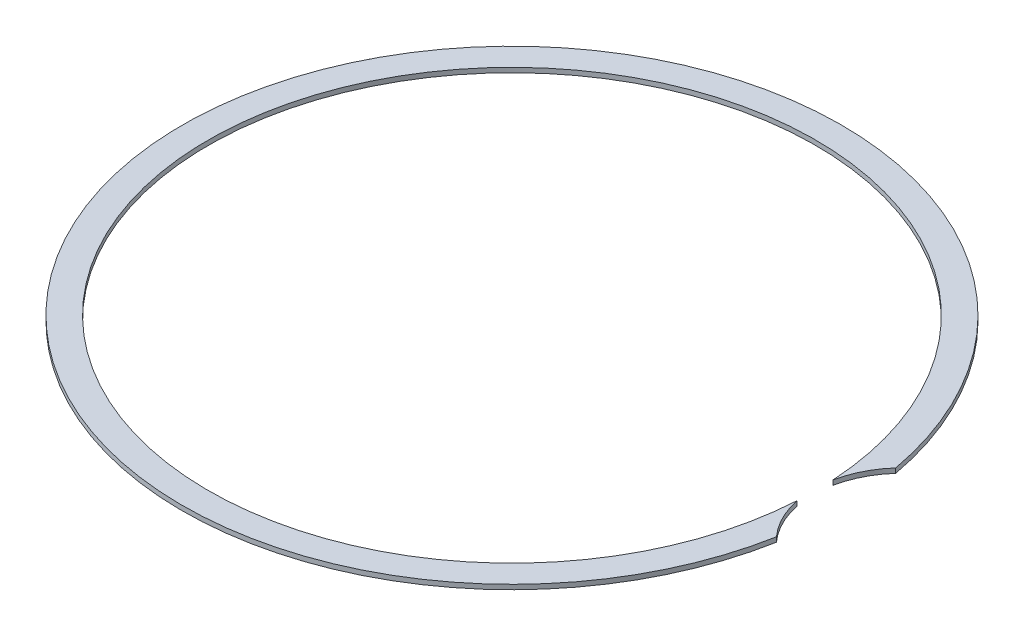
ISO-10303-21;
HEADER;
FILE_DESCRIPTION(('STEP AP214'),'2;1');
FILE_NAME('part.step','',(''),(''),'','','');
FILE_SCHEMA(('AUTOMOTIVE_DESIGN { 1 0 10303 214 1 1 1 1 }'));
ENDSEC;
DATA;
#1=APPLICATION_CONTEXT('core data for automotive mechanical design processes');
#2=APPLICATION_PROTOCOL_DEFINITION('international standard','automotive_design',2000,#1);
#3=PRODUCT_CONTEXT('',#1,'mechanical');
#4=PRODUCT('Part','Part','',(#3));
#5=PRODUCT_RELATED_PRODUCT_CATEGORY('part','',(#4));
#6=PRODUCT_DEFINITION_FORMATION('','',#4);
#7=PRODUCT_DEFINITION_CONTEXT('part definition',#1,'design');
#8=PRODUCT_DEFINITION('design','',#6,#7);
#9=PRODUCT_DEFINITION_SHAPE('','',#8);
#10=(LENGTH_UNIT() NAMED_UNIT(*) SI_UNIT(.MILLI.,.METRE.));
#11=(NAMED_UNIT(*) PLANE_ANGLE_UNIT() SI_UNIT($,.RADIAN.));
#12=(NAMED_UNIT(*) SI_UNIT($,.STERADIAN.) SOLID_ANGLE_UNIT());
#13=UNCERTAINTY_MEASURE_WITH_UNIT(LENGTH_MEASURE(1.E-05),#10,'distance_accuracy_value','');
#14=(GEOMETRIC_REPRESENTATION_CONTEXT(3) GLOBAL_UNCERTAINTY_ASSIGNED_CONTEXT((#13)) GLOBAL_UNIT_ASSIGNED_CONTEXT((#10,
#11,#12)) REPRESENTATION_CONTEXT('',''));
#15=CARTESIAN_POINT('',(0.,0.,0.));
#16=DIRECTION('',(0.,0.,1.));
#17=DIRECTION('',(1.,0.,0.));
#18=AXIS2_PLACEMENT_3D('',#15,#16,#17);
#19=CARTESIAN_POINT('',(41.5,0.5,0.));
#20=DIRECTION('',(0.,-1.,0.));
#21=DIRECTION('',(0.,0.,-1.));
#22=AXIS2_PLACEMENT_3D('',#19,#20,#21);
#23=CYLINDRICAL_SURFACE('',#22,9.49999999999998);
#24=CARTESIAN_POINT('',(41.5,0.,0.));
#25=DIRECTION('',(0.,-1.,0.));
#26=DIRECTION('',(0.,0.,1.));
#27=AXIS2_PLACEMENT_3D('',#24,#25,#26);
#28=CIRCLE('',#27,9.49999999999998);
#29=CARTESIAN_POINT('',(32.1935240963855,0.,-1.90774900221261));
#30=VERTEX_POINT('',#29);
#31=CARTESIAN_POINT('',(34.421686746988,0.,-6.33620402861475));
#32=VERTEX_POINT('',#31);
#33=EDGE_CURVE('E102',#30,#32,#28,.T.);
#34=ORIENTED_EDGE('',*,*,#33,.T.);
#35=DIRECTION('',(0.,-1.,0.));
#36=VECTOR('',#35,1.);
#37=CARTESIAN_POINT('',(34.421686746988,0.5,-6.33620402861475));
#38=LINE('',#37,#36);
#39=CARTESIAN_POINT('',(34.421686746988,0.5,-6.33620402861475));
#40=VERTEX_POINT('',#39);
#41=EDGE_CURVE('E11',#40,#32,#38,.T.);
#42=ORIENTED_EDGE('',*,*,#41,.F.);
#43=CARTESIAN_POINT('',(41.5,0.5,0.));
#44=DIRECTION('',(0.,-1.,0.));
#45=DIRECTION('',(0.,0.,1.));
#46=AXIS2_PLACEMENT_3D('',#43,#44,#45);
#47=CIRCLE('',#46,9.49999999999998);
#48=CARTESIAN_POINT('',(32.1935240963855,0.5,-1.90774900221261));
#49=VERTEX_POINT('',#48);
#50=EDGE_CURVE('E90',#49,#40,#47,.T.);
#51=ORIENTED_EDGE('',*,*,#50,.F.);
#52=DIRECTION('',(0.,-1.,0.));
#53=VECTOR('',#52,1.);
#54=CARTESIAN_POINT('',(32.1935240963855,0.5,-1.90774900221261));
#55=LINE('',#54,#53);
#56=EDGE_CURVE('E98',#49,#30,#55,.T.);
#57=ORIENTED_EDGE('',*,*,#56,.T.);
#58=EDGE_LOOP('',(#34,#42,#51,#57));
#59=FACE_BOUND('',#58,.T.);
#60=ADVANCED_FACE('F39',(#59),#23,.F.);
#61=CARTESIAN_POINT('',(0.,0.5,0.));
#62=DIRECTION('',(0.,-1.,0.));
#63=DIRECTION('',(0.,0.,-1.));
#64=AXIS2_PLACEMENT_3D('',#61,#62,#63);
#65=CYLINDRICAL_SURFACE('',#64,35.);
#66=CARTESIAN_POINT('',(0.,0.,0.));
#67=DIRECTION('',(0.,1.,0.));
#68=DIRECTION('',(0.,0.,1.));
#69=AXIS2_PLACEMENT_3D('',#66,#67,#68);
#70=CIRCLE('',#69,35.);
#71=CARTESIAN_POINT('',(34.421686746988,0.,6.33620402861475));
#72=VERTEX_POINT('',#71);
#73=EDGE_CURVE('E94',#32,#72,#70,.T.);
#74=ORIENTED_EDGE('',*,*,#73,.T.);
#75=DIRECTION('',(0.,-1.,0.));
#76=VECTOR('',#75,1.);
#77=CARTESIAN_POINT('',(34.421686746988,0.5,6.33620402861475));
#78=LINE('',#77,#76);
#79=CARTESIAN_POINT('',(34.421686746988,0.5,6.33620402861475));
#80=VERTEX_POINT('',#79);
#81=EDGE_CURVE('E47',#80,#72,#78,.T.);
#82=ORIENTED_EDGE('',*,*,#81,.F.);
#83=CARTESIAN_POINT('',(0.,0.5,0.));
#84=DIRECTION('',(0.,1.,0.));
#85=DIRECTION('',(0.,0.,1.));
#86=AXIS2_PLACEMENT_3D('',#83,#84,#85);
#87=CIRCLE('',#86,35.);
#88=EDGE_CURVE('E85',#40,#80,#87,.T.);
#89=ORIENTED_EDGE('',*,*,#88,.F.);
#90=ORIENTED_EDGE('',*,*,#41,.T.);
#91=EDGE_LOOP('',(#74,#82,#89,#90));
#92=FACE_BOUND('',#91,.T.);
#93=ADVANCED_FACE('F93',(#92),#65,.T.);
#94=CARTESIAN_POINT('',(41.5,0.5,0.));
#95=DIRECTION('',(0.,-1.,0.));
#96=DIRECTION('',(0.,0.,-1.));
#97=AXIS2_PLACEMENT_3D('',#94,#95,#96);
#98=CYLINDRICAL_SURFACE('',#97,9.49999999999998);
#99=CARTESIAN_POINT('',(41.5,0.,0.));
#100=DIRECTION('',(0.,-1.,0.));
#101=DIRECTION('',(0.,0.,1.));
#102=AXIS2_PLACEMENT_3D('',#99,#100,#101);
#103=CIRCLE('',#102,9.49999999999998);
#104=CARTESIAN_POINT('',(32.1935240963855,0.,1.90774900221259));
#105=VERTEX_POINT('',#104);
#106=EDGE_CURVE('E72',#72,#105,#103,.T.);
#107=ORIENTED_EDGE('',*,*,#106,.T.);
#108=DIRECTION('',(0.,-1.,0.));
#109=VECTOR('',#108,1.);
#110=CARTESIAN_POINT('',(32.1935240963855,0.5,1.90774900221259));
#111=LINE('',#110,#109);
#112=CARTESIAN_POINT('',(32.1935240963855,0.5,1.90774900221259));
#113=VERTEX_POINT('',#112);
#114=EDGE_CURVE('E95',#113,#105,#111,.T.);
#115=ORIENTED_EDGE('',*,*,#114,.F.);
#116=CARTESIAN_POINT('',(41.5,0.5,0.));
#117=DIRECTION('',(0.,-1.,0.));
#118=DIRECTION('',(0.,0.,1.));
#119=AXIS2_PLACEMENT_3D('',#116,#117,#118);
#120=CIRCLE('',#119,9.49999999999998);
#121=EDGE_CURVE('E88',#80,#113,#120,.T.);
#122=ORIENTED_EDGE('',*,*,#121,.F.);
#123=ORIENTED_EDGE('',*,*,#81,.T.);
#124=EDGE_LOOP('',(#107,#115,#122,#123));
#125=FACE_BOUND('',#124,.T.);
#126=ADVANCED_FACE('F96',(#125),#98,.F.);
#127=CARTESIAN_POINT('',(0.,0.5,0.));
#128=DIRECTION('',(0.,-1.,0.));
#129=DIRECTION('',(0.,0.,-1.));
#130=AXIS2_PLACEMENT_3D('',#127,#128,#129);
#131=CYLINDRICAL_SURFACE('',#130,32.25);
#132=CARTESIAN_POINT('',(0.,0.,0.));
#133=DIRECTION('',(0.,-1.,0.));
#134=DIRECTION('',(0.,0.,1.));
#135=AXIS2_PLACEMENT_3D('',#132,#133,#134);
#136=CIRCLE('',#135,32.25);
#137=EDGE_CURVE('E78',#105,#30,#136,.T.);
#138=ORIENTED_EDGE('',*,*,#137,.T.);
#139=ORIENTED_EDGE('',*,*,#56,.F.);
#140=CARTESIAN_POINT('',(0.,0.5,0.));
#141=DIRECTION('',(0.,-1.,0.));
#142=DIRECTION('',(0.,0.,1.));
#143=AXIS2_PLACEMENT_3D('',#140,#141,#142);
#144=CIRCLE('',#143,32.25);
#145=EDGE_CURVE('E55',#113,#49,#144,.T.);
#146=ORIENTED_EDGE('',*,*,#145,.F.);
#147=ORIENTED_EDGE('',*,*,#114,.T.);
#148=EDGE_LOOP('',(#138,#139,#146,#147));
#149=FACE_BOUND('',#148,.T.);
#150=ADVANCED_FACE('F109',(#149),#131,.F.);
#151=CARTESIAN_POINT('',(20.75,0.5,0.));
#152=DIRECTION('',(0.,1.,0.));
#153=DIRECTION('',(0.,0.,1.));
#154=AXIS2_PLACEMENT_3D('',#151,#152,#153);
#155=PLANE('',#154);
#156=ORIENTED_EDGE('',*,*,#50,.T.);
#157=ORIENTED_EDGE('',*,*,#88,.T.);
#158=ORIENTED_EDGE('',*,*,#121,.T.);
#159=ORIENTED_EDGE('',*,*,#145,.T.);
#160=EDGE_LOOP('',(#156,#157,#158,#159));
#161=FACE_BOUND('',#160,.T.);
#162=ADVANCED_FACE('F86',(#161),#155,.T.);
#163=CARTESIAN_POINT('',(20.75,0.,0.));
#164=DIRECTION('',(0.,1.,0.));
#165=DIRECTION('',(0.,0.,1.));
#166=AXIS2_PLACEMENT_3D('',#163,#164,#165);
#167=PLANE('',#166);
#168=ORIENTED_EDGE('',*,*,#33,.F.);
#169=ORIENTED_EDGE('',*,*,#137,.F.);
#170=ORIENTED_EDGE('',*,*,#106,.F.);
#171=ORIENTED_EDGE('',*,*,#73,.F.);
#172=EDGE_LOOP('',(#168,#169,#170,#171));
#173=FACE_BOUND('',#172,.T.);
#174=ADVANCED_FACE('F112',(#173),#167,.F.);
#175=CLOSED_SHELL('',(#60,#93,#126,#150,#162,#174));
#176=MANIFOLD_SOLID_BREP('B2',#175);
#177=ADVANCED_BREP_SHAPE_REPRESENTATION('',(#18,#176),#14);
#178=SHAPE_DEFINITION_REPRESENTATION(#9,#177);
ENDSEC;
END-ISO-10303-21;
